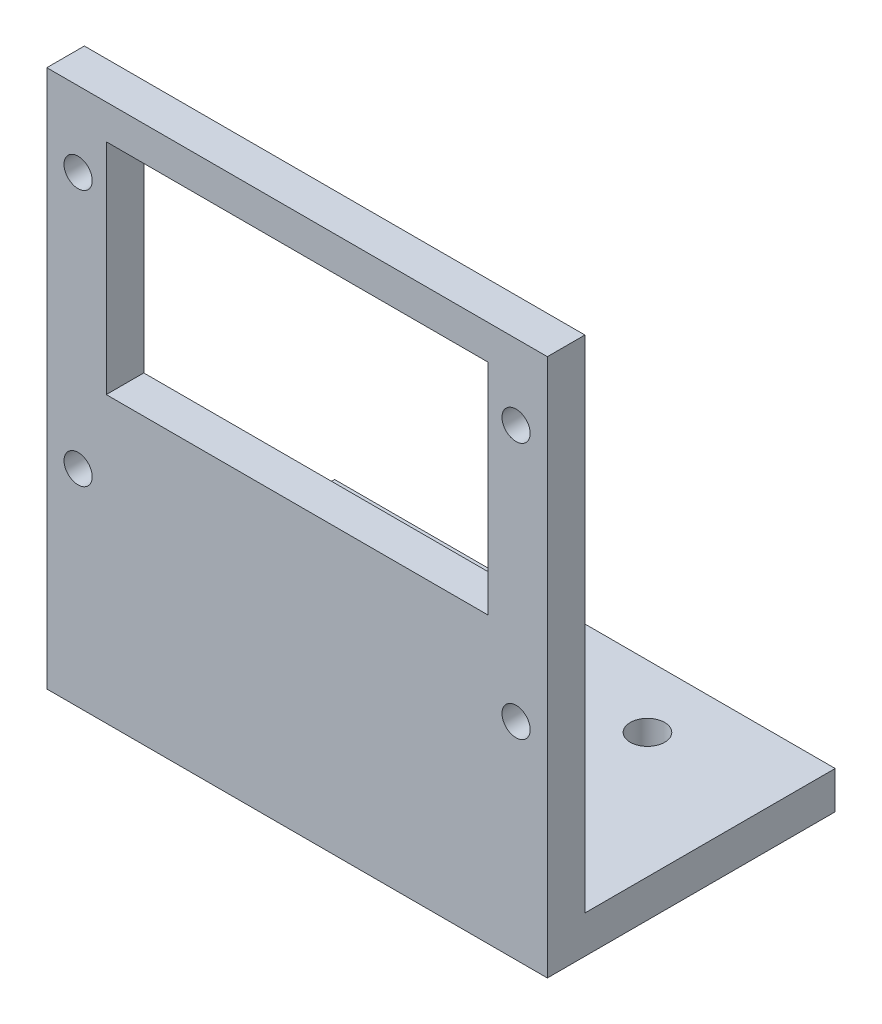
ISO-10303-21;
HEADER;
FILE_DESCRIPTION(('STEP AP214'),'2;1');
FILE_NAME('part.step','',(''),(''),'','','');
FILE_SCHEMA(('AUTOMOTIVE_DESIGN { 1 0 10303 214 1 1 1 1 }'));
ENDSEC;
DATA;
#1=APPLICATION_CONTEXT('core data for automotive mechanical design processes');
#2=APPLICATION_PROTOCOL_DEFINITION('international standard','automotive_design',2000,#1);
#3=PRODUCT_CONTEXT('',#1,'mechanical');
#4=PRODUCT('Part','Part','',(#3));
#5=PRODUCT_RELATED_PRODUCT_CATEGORY('part','',(#4));
#6=PRODUCT_DEFINITION_FORMATION('','',#4);
#7=PRODUCT_DEFINITION_CONTEXT('part definition',#1,'design');
#8=PRODUCT_DEFINITION('design','',#6,#7);
#9=PRODUCT_DEFINITION_SHAPE('','',#8);
#10=(LENGTH_UNIT() NAMED_UNIT(*) SI_UNIT(.MILLI.,.METRE.));
#11=(NAMED_UNIT(*) PLANE_ANGLE_UNIT() SI_UNIT($,.RADIAN.));
#12=(NAMED_UNIT(*) SI_UNIT($,.STERADIAN.) SOLID_ANGLE_UNIT());
#13=UNCERTAINTY_MEASURE_WITH_UNIT(LENGTH_MEASURE(1.E-05),#10,'distance_accuracy_value','');
#14=(GEOMETRIC_REPRESENTATION_CONTEXT(3) GLOBAL_UNCERTAINTY_ASSIGNED_CONTEXT((#13)) GLOBAL_UNIT_ASSIGNED_CONTEXT((#10,
#11,#12)) REPRESENTATION_CONTEXT('',''));
#15=CARTESIAN_POINT('',(0.,0.,0.));
#16=DIRECTION('',(0.,0.,1.));
#17=DIRECTION('',(1.,0.,0.));
#18=AXIS2_PLACEMENT_3D('',#15,#16,#17);
#19=CARTESIAN_POINT('',(20.,0.001899999999978,10.));
#20=DIRECTION('',(0.,1.,0.));
#21=DIRECTION('',(0.,0.,1.));
#22=AXIS2_PLACEMENT_3D('',#19,#20,#21);
#23=CYLINDRICAL_SURFACE('',#22,2.75);
#24=CARTESIAN_POINT('',(20.,0.001899999999978,10.));
#25=DIRECTION('',(0.,1.,0.));
#26=DIRECTION('',(0.,0.,1.));
#27=AXIS2_PLACEMENT_3D('',#24,#25,#26);
#28=CIRCLE('',#27,2.75);
#29=CARTESIAN_POINT('',(20.,0.001899999999978,12.75));
#30=VERTEX_POINT('',#29);
#31=EDGE_CURVE('E119',#30,#30,#28,.F.);
#32=ORIENTED_EDGE('',*,*,#31,.T.);
#33=EDGE_LOOP('',(#32));
#34=FACE_BOUND('',#33,.T.);
#35=CARTESIAN_POINT('',(20.,6.0019,10.));
#36=DIRECTION('',(0.,1.,0.));
#37=DIRECTION('',(0.,0.,1.));
#38=AXIS2_PLACEMENT_3D('',#35,#36,#37);
#39=CIRCLE('',#38,2.75);
#40=CARTESIAN_POINT('',(20.,6.0019,12.75));
#41=VERTEX_POINT('',#40);
#42=EDGE_CURVE('E18',#41,#41,#39,.F.);
#43=ORIENTED_EDGE('',*,*,#42,.F.);
#44=EDGE_LOOP('',(#43));
#45=FACE_BOUND('',#44,.T.);
#46=ADVANCED_FACE('F15',(#34,#45),#23,.F.);
#47=CARTESIAN_POINT('',(20.,0.001899999999978,30.));
#48=DIRECTION('',(0.,1.,0.));
#49=DIRECTION('',(0.,0.,1.));
#50=AXIS2_PLACEMENT_3D('',#47,#48,#49);
#51=CYLINDRICAL_SURFACE('',#50,2.75);
#52=CARTESIAN_POINT('',(20.,0.001899999999978,30.));
#53=DIRECTION('',(0.,1.,0.));
#54=DIRECTION('',(0.,0.,1.));
#55=AXIS2_PLACEMENT_3D('',#52,#53,#54);
#56=CIRCLE('',#55,2.75);
#57=CARTESIAN_POINT('',(20.,0.001899999999978,32.75));
#58=VERTEX_POINT('',#57);
#59=EDGE_CURVE('E154',#58,#58,#56,.F.);
#60=ORIENTED_EDGE('',*,*,#59,.T.);
#61=EDGE_LOOP('',(#60));
#62=FACE_BOUND('',#61,.T.);
#63=CARTESIAN_POINT('',(20.,6.0019,30.));
#64=DIRECTION('',(0.,1.,0.));
#65=DIRECTION('',(0.,0.,1.));
#66=AXIS2_PLACEMENT_3D('',#63,#64,#65);
#67=CIRCLE('',#66,2.75);
#68=CARTESIAN_POINT('',(20.,6.0019,32.75));
#69=VERTEX_POINT('',#68);
#70=EDGE_CURVE('E163',#69,#69,#67,.F.);
#71=ORIENTED_EDGE('',*,*,#70,.F.);
#72=EDGE_LOOP('',(#71));
#73=FACE_BOUND('',#72,.T.);
#74=ADVANCED_FACE('F172',(#62,#73),#51,.F.);
#75=CARTESIAN_POINT('',(60.,0.001899999999978,10.));
#76=DIRECTION('',(0.,1.,0.));
#77=DIRECTION('',(0.,0.,1.));
#78=AXIS2_PLACEMENT_3D('',#75,#76,#77);
#79=CYLINDRICAL_SURFACE('',#78,2.75);
#80=CARTESIAN_POINT('',(60.,0.001899999999978,10.));
#81=DIRECTION('',(0.,1.,0.));
#82=DIRECTION('',(0.,0.,1.));
#83=AXIS2_PLACEMENT_3D('',#80,#81,#82);
#84=CIRCLE('',#83,2.75);
#85=CARTESIAN_POINT('',(60.,0.001899999999978,12.75));
#86=VERTEX_POINT('',#85);
#87=EDGE_CURVE('E151',#86,#86,#84,.F.);
#88=ORIENTED_EDGE('',*,*,#87,.T.);
#89=EDGE_LOOP('',(#88));
#90=FACE_BOUND('',#89,.T.);
#91=CARTESIAN_POINT('',(60.,6.0019,10.));
#92=DIRECTION('',(0.,1.,0.));
#93=DIRECTION('',(0.,0.,1.));
#94=AXIS2_PLACEMENT_3D('',#91,#92,#93);
#95=CIRCLE('',#94,2.75);
#96=CARTESIAN_POINT('',(60.,6.0019,12.75));
#97=VERTEX_POINT('',#96);
#98=EDGE_CURVE('E161',#97,#97,#95,.F.);
#99=ORIENTED_EDGE('',*,*,#98,.F.);
#100=EDGE_LOOP('',(#99));
#101=FACE_BOUND('',#100,.T.);
#102=ADVANCED_FACE('F178',(#90,#101),#79,.F.);
#103=CARTESIAN_POINT('',(60.,0.001899999999978,30.));
#104=DIRECTION('',(0.,1.,0.));
#105=DIRECTION('',(0.,0.,1.));
#106=AXIS2_PLACEMENT_3D('',#103,#104,#105);
#107=CYLINDRICAL_SURFACE('',#106,2.75);
#108=CARTESIAN_POINT('',(60.,0.001899999999978,30.));
#109=DIRECTION('',(0.,1.,0.));
#110=DIRECTION('',(0.,0.,1.));
#111=AXIS2_PLACEMENT_3D('',#108,#109,#110);
#112=CIRCLE('',#111,2.75);
#113=CARTESIAN_POINT('',(60.,0.001899999999978,32.75));
#114=VERTEX_POINT('',#113);
#115=EDGE_CURVE('E147',#114,#114,#112,.F.);
#116=ORIENTED_EDGE('',*,*,#115,.T.);
#117=EDGE_LOOP('',(#116));
#118=FACE_BOUND('',#117,.T.);
#119=CARTESIAN_POINT('',(60.,6.0019,30.));
#120=DIRECTION('',(0.,1.,0.));
#121=DIRECTION('',(0.,0.,1.));
#122=AXIS2_PLACEMENT_3D('',#119,#120,#121);
#123=CIRCLE('',#122,2.75);
#124=CARTESIAN_POINT('',(60.,6.0019,32.75));
#125=VERTEX_POINT('',#124);
#126=EDGE_CURVE('E105',#125,#125,#123,.F.);
#127=ORIENTED_EDGE('',*,*,#126,.F.);
#128=EDGE_LOOP('',(#127));
#129=FACE_BOUND('',#128,.T.);
#130=ADVANCED_FACE('F257',(#118,#129),#107,.F.);
#131=CARTESIAN_POINT('',(0.,0.001899999999978,0.));
#132=DIRECTION('',(0.,0.,1.));
#133=DIRECTION('',(1.,0.,0.));
#134=AXIS2_PLACEMENT_3D('',#131,#132,#133);
#135=PLANE('',#134);
#136=DIRECTION('',(0.,1.,0.));
#137=VECTOR('',#136,1.);
#138=CARTESIAN_POINT('',(80.,0.001899999999978,0.));
#139=LINE('',#138,#137);
#140=CARTESIAN_POINT('',(80.,0.001899999999978,0.));
#141=VERTEX_POINT('',#140);
#142=CARTESIAN_POINT('',(80.,6.0019,0.));
#143=VERTEX_POINT('',#142);
#144=EDGE_CURVE('E150',#141,#143,#139,.T.);
#145=ORIENTED_EDGE('',*,*,#144,.F.);
#146=DIRECTION('',(1.,0.,0.));
#147=VECTOR('',#146,1.);
#148=CARTESIAN_POINT('',(0.,0.001899999999978,0.));
#149=LINE('',#148,#147);
#150=CARTESIAN_POINT('',(0.,0.001899999999978,0.));
#151=VERTEX_POINT('',#150);
#152=EDGE_CURVE('E101',#141,#151,#149,.F.);
#153=ORIENTED_EDGE('',*,*,#152,.T.);
#154=DIRECTION('',(0.,1.,0.));
#155=VECTOR('',#154,1.);
#156=CARTESIAN_POINT('',(0.,0.001899999999978,0.));
#157=LINE('',#156,#155);
#158=CARTESIAN_POINT('',(0.,6.0019,0.));
#159=VERTEX_POINT('',#158);
#160=EDGE_CURVE('E95',#151,#159,#157,.T.);
#161=ORIENTED_EDGE('',*,*,#160,.T.);
#162=DIRECTION('',(1.,0.,0.));
#163=VECTOR('',#162,1.);
#164=CARTESIAN_POINT('',(0.,6.0019,0.));
#165=LINE('',#164,#163);
#166=EDGE_CURVE('E99',#143,#159,#165,.F.);
#167=ORIENTED_EDGE('',*,*,#166,.F.);
#168=EDGE_LOOP('',(#145,#153,#161,#167));
#169=FACE_BOUND('',#168,.T.);
#170=ADVANCED_FACE('F98',(#169),#135,.F.);
#171=CARTESIAN_POINT('',(0.,6.0019,0.));
#172=DIRECTION('',(0.,1.,0.));
#173=DIRECTION('',(0.,0.,1.));
#174=AXIS2_PLACEMENT_3D('',#171,#172,#173);
#175=PLANE('',#174);
#176=ORIENTED_EDGE('',*,*,#126,.T.);
#177=EDGE_LOOP('',(#176));
#178=FACE_BOUND('',#177,.T.);
#179=ORIENTED_EDGE('',*,*,#98,.T.);
#180=EDGE_LOOP('',(#179));
#181=FACE_BOUND('',#180,.T.);
#182=ORIENTED_EDGE('',*,*,#70,.T.);
#183=EDGE_LOOP('',(#182));
#184=FACE_BOUND('',#183,.T.);
#185=ORIENTED_EDGE('',*,*,#42,.T.);
#186=EDGE_LOOP('',(#185));
#187=FACE_BOUND('',#186,.T.);
#188=DIRECTION('',(1.,0.,0.));
#189=VECTOR('',#188,1.);
#190=CARTESIAN_POINT('',(0.,6.0019,40.));
#191=LINE('',#190,#189);
#192=CARTESIAN_POINT('',(0.,6.0019,40.));
#193=VERTEX_POINT('',#192);
#194=CARTESIAN_POINT('',(80.,6.0019,40.));
#195=VERTEX_POINT('',#194);
#196=EDGE_CURVE('E146',#193,#195,#191,.T.);
#197=ORIENTED_EDGE('',*,*,#196,.T.);
#198=DIRECTION('',(0.,0.,-1.));
#199=VECTOR('',#198,1.);
#200=CARTESIAN_POINT('',(80.,6.0019,0.));
#201=LINE('',#200,#199);
#202=EDGE_CURVE('E111',#143,#195,#201,.F.);
#203=ORIENTED_EDGE('',*,*,#202,.F.);
#204=ORIENTED_EDGE('',*,*,#166,.T.);
#205=DIRECTION('',(0.,0.,-1.));
#206=VECTOR('',#205,1.);
#207=CARTESIAN_POINT('',(0.,6.0019,0.));
#208=LINE('',#207,#206);
#209=EDGE_CURVE('E104',#159,#193,#208,.F.);
#210=ORIENTED_EDGE('',*,*,#209,.T.);
#211=EDGE_LOOP('',(#197,#203,#204,#210));
#212=FACE_BOUND('',#211,.T.);
#213=ADVANCED_FACE('F108',(#178,#181,#184,#187,#212),#175,.T.);
#214=CARTESIAN_POINT('',(5.,33.0019,40.0000000003047));
#215=DIRECTION('',(0.,0.,-1.));
#216=DIRECTION('',(-1.,0.,0.));
#217=AXIS2_PLACEMENT_3D('',#214,#215,#216);
#218=CONICAL_SURFACE('',#217,3.99999999984402,0.718829999623637);
#219=CARTESIAN_POINT('',(5.,33.0019,40.0000000000773));
#220=DIRECTION('',(0.,0.,-1.));
#221=DIRECTION('',(-1.,0.,0.));
#222=AXIS2_PLACEMENT_3D('',#219,#220,#221);
#223=CIRCLE('',#222,4.00000000004297);
#224=CARTESIAN_POINT('',(0.999999999957027,33.0019,40.0000000000773));
#225=VERTEX_POINT('',#224);
#226=EDGE_CURVE('E143',#225,#225,#223,.T.);
#227=ORIENTED_EDGE('',*,*,#226,.T.);
#228=EDGE_LOOP('',(#227));
#229=FACE_BOUND('',#228,.T.);
#230=CARTESIAN_POINT('',(5.,33.0019,42.));
#231=DIRECTION('',(0.,0.,1.));
#232=DIRECTION('',(1.,0.,0.));
#233=AXIS2_PLACEMENT_3D('',#230,#231,#232);
#234=CIRCLE('',#233,2.25);
#235=CARTESIAN_POINT('',(7.25,33.0019,42.));
#236=VERTEX_POINT('',#235);
#237=EDGE_CURVE('E428',#236,#236,#234,.T.);
#238=ORIENTED_EDGE('',*,*,#237,.T.);
#239=EDGE_LOOP('',(#238));
#240=FACE_BOUND('',#239,.T.);
#241=ADVANCED_FACE('F247',(#229,#240),#218,.F.);
#242=CARTESIAN_POINT('',(75.,33.0019,40.0000000003615));
#243=DIRECTION('',(0.,0.,-1.));
#244=DIRECTION('',(-1.,0.,0.));
#245=AXIS2_PLACEMENT_3D('',#242,#243,#244);
#246=CONICAL_SURFACE('',#245,3.99999999978036,0.718829999621625);
#247=CARTESIAN_POINT('',(75.,33.0019,40.0000000000773));
#248=DIRECTION('',(0.,0.,-1.));
#249=DIRECTION('',(-1.,0.,0.));
#250=AXIS2_PLACEMENT_3D('',#247,#248,#249);
#251=CIRCLE('',#250,4.00000000002905);
#252=CARTESIAN_POINT('',(70.999999999971,33.0019,40.0000000000773));
#253=VERTEX_POINT('',#252);
#254=EDGE_CURVE('E140',#253,#253,#251,.T.);
#255=ORIENTED_EDGE('',*,*,#254,.T.);
#256=EDGE_LOOP('',(#255));
#257=FACE_BOUND('',#256,.T.);
#258=CARTESIAN_POINT('',(75.,33.0019,42.));
#259=DIRECTION('',(0.,0.,1.));
#260=DIRECTION('',(1.,0.,0.));
#261=AXIS2_PLACEMENT_3D('',#258,#259,#260);
#262=CIRCLE('',#261,2.25);
#263=CARTESIAN_POINT('',(77.25,33.0019,42.));
#264=VERTEX_POINT('',#263);
#265=EDGE_CURVE('E430',#264,#264,#262,.T.);
#266=ORIENTED_EDGE('',*,*,#265,.T.);
#267=EDGE_LOOP('',(#266));
#268=FACE_BOUND('',#267,.T.);
#269=ADVANCED_FACE('F243',(#257,#268),#246,.F.);
#270=CARTESIAN_POINT('',(5.,74.0019,40.0000000003047));
#271=DIRECTION('',(0.,0.,-1.));
#272=DIRECTION('',(-1.,0.,0.));
#273=AXIS2_PLACEMENT_3D('',#270,#271,#272);
#274=CONICAL_SURFACE('',#273,3.99999999984402,0.718829999623637);
#275=CARTESIAN_POINT('',(5.,74.0019,40.0000000000773));
#276=DIRECTION('',(0.,0.,-1.));
#277=DIRECTION('',(-1.,0.,0.));
#278=AXIS2_PLACEMENT_3D('',#275,#276,#277);
#279=CIRCLE('',#278,4.00000000004297);
#280=CARTESIAN_POINT('',(0.999999999957027,74.0019,40.0000000000773));
#281=VERTEX_POINT('',#280);
#282=EDGE_CURVE('E137',#281,#281,#279,.T.);
#283=ORIENTED_EDGE('',*,*,#282,.T.);
#284=EDGE_LOOP('',(#283));
#285=FACE_BOUND('',#284,.T.);
#286=CARTESIAN_POINT('',(5.,74.0019,42.));
#287=DIRECTION('',(0.,0.,1.));
#288=DIRECTION('',(1.,0.,0.));
#289=AXIS2_PLACEMENT_3D('',#286,#287,#288);
#290=CIRCLE('',#289,2.25);
#291=CARTESIAN_POINT('',(7.25,74.0019,42.));
#292=VERTEX_POINT('',#291);
#293=EDGE_CURVE('E434',#292,#292,#290,.T.);
#294=ORIENTED_EDGE('',*,*,#293,.T.);
#295=EDGE_LOOP('',(#294));
#296=FACE_BOUND('',#295,.T.);
#297=ADVANCED_FACE('F239',(#285,#296),#274,.F.);
#298=CARTESIAN_POINT('',(0.,0.001899999999978,40.));
#299=DIRECTION('',(0.,0.,1.));
#300=DIRECTION('',(1.,0.,0.));
#301=AXIS2_PLACEMENT_3D('',#298,#299,#300);
#302=PLANE('',#301);
#303=CARTESIAN_POINT('',(75.,74.0019,40.0000000000773));
#304=DIRECTION('',(0.,0.,-1.));
#305=DIRECTION('',(-1.,0.,0.));
#306=AXIS2_PLACEMENT_3D('',#303,#304,#305);
#307=CIRCLE('',#306,4.00000000002905);
#308=CARTESIAN_POINT('',(70.999999999971,74.0019,40.0000000000773));
#309=VERTEX_POINT('',#308);
#310=EDGE_CURVE('E134',#309,#309,#307,.F.);
#311=ORIENTED_EDGE('',*,*,#310,.T.);
#312=EDGE_LOOP('',(#311));
#313=FACE_BOUND('',#312,.T.);
#314=DIRECTION('',(0.,1.,0.));
#315=VECTOR('',#314,1.);
#316=CARTESIAN_POINT('',(70.5,45.5019,40.));
#317=LINE('',#316,#315);
#318=CARTESIAN_POINT('',(70.5,45.5019,40.));
#319=VERTEX_POINT('',#318);
#320=CARTESIAN_POINT('',(70.5,80.5019,40.));
#321=VERTEX_POINT('',#320);
#322=EDGE_CURVE('E481',#319,#321,#317,.T.);
#323=ORIENTED_EDGE('',*,*,#322,.T.);
#324=DIRECTION('',(1.,0.,0.));
#325=VECTOR('',#324,1.);
#326=CARTESIAN_POINT('',(9.5,80.5019,40.));
#327=LINE('',#326,#325);
#328=CARTESIAN_POINT('',(9.5,80.5019,40.));
#329=VERTEX_POINT('',#328);
#330=EDGE_CURVE('E485',#321,#329,#327,.F.);
#331=ORIENTED_EDGE('',*,*,#330,.T.);
#332=DIRECTION('',(0.,1.,0.));
#333=VECTOR('',#332,1.);
#334=CARTESIAN_POINT('',(9.5,45.5019,40.));
#335=LINE('',#334,#333);
#336=CARTESIAN_POINT('',(9.5,45.5019,40.));
#337=VERTEX_POINT('',#336);
#338=EDGE_CURVE('E487',#337,#329,#335,.T.);
#339=ORIENTED_EDGE('',*,*,#338,.F.);
#340=DIRECTION('',(1.,0.,0.));
#341=VECTOR('',#340,1.);
#342=CARTESIAN_POINT('',(9.5,45.5019,40.));
#343=LINE('',#342,#341);
#344=EDGE_CURVE('E476',#319,#337,#343,.F.);
#345=ORIENTED_EDGE('',*,*,#344,.F.);
#346=EDGE_LOOP('',(#323,#331,#339,#345));
#347=FACE_BOUND('',#346,.T.);
#348=ORIENTED_EDGE('',*,*,#282,.F.);
#349=EDGE_LOOP('',(#348));
#350=FACE_BOUND('',#349,.T.);
#351=ORIENTED_EDGE('',*,*,#254,.F.);
#352=EDGE_LOOP('',(#351));
#353=FACE_BOUND('',#352,.T.);
#354=ORIENTED_EDGE('',*,*,#226,.F.);
#355=EDGE_LOOP('',(#354));
#356=FACE_BOUND('',#355,.T.);
#357=DIRECTION('',(0.,1.,0.));
#358=VECTOR('',#357,1.);
#359=CARTESIAN_POINT('',(80.,0.001899999999978,40.));
#360=LINE('',#359,#358);
#361=CARTESIAN_POINT('',(80.,86.0019,40.));
#362=VERTEX_POINT('',#361);
#363=EDGE_CURVE('E446',#195,#362,#360,.T.);
#364=ORIENTED_EDGE('',*,*,#363,.F.);
#365=ORIENTED_EDGE('',*,*,#196,.F.);
#366=DIRECTION('',(0.,1.,0.));
#367=VECTOR('',#366,1.);
#368=CARTESIAN_POINT('',(0.,0.001899999999978,40.));
#369=LINE('',#368,#367);
#370=CARTESIAN_POINT('',(0.,86.0019,40.));
#371=VERTEX_POINT('',#370);
#372=EDGE_CURVE('E117',#193,#371,#369,.T.);
#373=ORIENTED_EDGE('',*,*,#372,.T.);
#374=DIRECTION('',(1.,0.,0.));
#375=VECTOR('',#374,1.);
#376=CARTESIAN_POINT('',(0.,86.0019,40.));
#377=LINE('',#376,#375);
#378=EDGE_CURVE('E443',#362,#371,#377,.F.);
#379=ORIENTED_EDGE('',*,*,#378,.F.);
#380=EDGE_LOOP('',(#364,#365,#373,#379));
#381=FACE_BOUND('',#380,.T.);
#382=ADVANCED_FACE('F235',(#313,#347,#350,#353,#356,#381),#302,.F.);
#383=CARTESIAN_POINT('',(75.,74.0019,40.0000000003615));
#384=DIRECTION('',(0.,0.,-1.));
#385=DIRECTION('',(-1.,0.,0.));
#386=AXIS2_PLACEMENT_3D('',#383,#384,#385);
#387=CONICAL_SURFACE('',#386,3.99999999978036,0.718829999621625);
#388=ORIENTED_EDGE('',*,*,#310,.F.);
#389=EDGE_LOOP('',(#388));
#390=FACE_BOUND('',#389,.T.);
#391=CARTESIAN_POINT('',(75.,74.0019,42.));
#392=DIRECTION('',(0.,0.,1.));
#393=DIRECTION('',(1.,0.,0.));
#394=AXIS2_PLACEMENT_3D('',#391,#392,#393);
#395=CIRCLE('',#394,2.25);
#396=CARTESIAN_POINT('',(77.25,74.0019,42.));
#397=VERTEX_POINT('',#396);
#398=EDGE_CURVE('E466',#397,#397,#395,.T.);
#399=ORIENTED_EDGE('',*,*,#398,.T.);
#400=EDGE_LOOP('',(#399));
#401=FACE_BOUND('',#400,.T.);
#402=ADVANCED_FACE('F232',(#390,#401),#387,.F.);
#403=CARTESIAN_POINT('',(0.,0.001899999999978,40.));
#404=DIRECTION('',(1.,0.,0.));
#405=DIRECTION('',(0.,0.,-1.));
#406=AXIS2_PLACEMENT_3D('',#403,#404,#405);
#407=PLANE('',#406);
#408=DIRECTION('',(0.,0.,1.));
#409=VECTOR('',#408,1.);
#410=CARTESIAN_POINT('',(0.,86.0019,40.));
#411=LINE('',#410,#409);
#412=CARTESIAN_POINT('',(0.,86.0019,46.));
#413=VERTEX_POINT('',#412);
#414=EDGE_CURVE('E437',#371,#413,#411,.T.);
#415=ORIENTED_EDGE('',*,*,#414,.F.);
#416=ORIENTED_EDGE('',*,*,#372,.F.);
#417=ORIENTED_EDGE('',*,*,#209,.F.);
#418=ORIENTED_EDGE('',*,*,#160,.F.);
#419=DIRECTION('',(0.,0.,1.));
#420=VECTOR('',#419,1.);
#421=CARTESIAN_POINT('',(0.,0.001899999999978,40.));
#422=LINE('',#421,#420);
#423=CARTESIAN_POINT('',(0.,0.001899999999978,46.));
#424=VERTEX_POINT('',#423);
#425=EDGE_CURVE('E90',#151,#424,#422,.T.);
#426=ORIENTED_EDGE('',*,*,#425,.T.);
#427=DIRECTION('',(0.,1.,0.));
#428=VECTOR('',#427,1.);
#429=CARTESIAN_POINT('',(0.,0.001899999999978,46.));
#430=LINE('',#429,#428);
#431=EDGE_CURVE('E462',#413,#424,#430,.F.);
#432=ORIENTED_EDGE('',*,*,#431,.F.);
#433=EDGE_LOOP('',(#415,#416,#417,#418,#426,#432));
#434=FACE_BOUND('',#433,.T.);
#435=ADVANCED_FACE('F116',(#434),#407,.F.);
#436=CARTESIAN_POINT('',(0.,0.001899999999978,40.));
#437=DIRECTION('',(0.,1.,0.));
#438=DIRECTION('',(0.,0.,1.));
#439=AXIS2_PLACEMENT_3D('',#436,#437,#438);
#440=PLANE('',#439);
#441=DIRECTION('',(1.,0.,0.));
#442=VECTOR('',#441,1.);
#443=CARTESIAN_POINT('',(0.,0.001899999999978,46.));
#444=LINE('',#443,#442);
#445=CARTESIAN_POINT('',(80.,0.001899999999978,46.));
#446=VERTEX_POINT('',#445);
#447=EDGE_CURVE('E459',#424,#446,#444,.T.);
#448=ORIENTED_EDGE('',*,*,#447,.F.);
#449=ORIENTED_EDGE('',*,*,#425,.F.);
#450=ORIENTED_EDGE('',*,*,#152,.F.);
#451=DIRECTION('',(0.,0.,-1.));
#452=VECTOR('',#451,1.);
#453=CARTESIAN_POINT('',(80.,0.001899999999978,40.));
#454=LINE('',#453,#452);
#455=EDGE_CURVE('E449',#446,#141,#454,.T.);
#456=ORIENTED_EDGE('',*,*,#455,.F.);
#457=EDGE_LOOP('',(#448,#449,#450,#456));
#458=FACE_BOUND('',#457,.T.);
#459=ORIENTED_EDGE('',*,*,#115,.F.);
#460=EDGE_LOOP('',(#459));
#461=FACE_BOUND('',#460,.T.);
#462=ORIENTED_EDGE('',*,*,#87,.F.);
#463=EDGE_LOOP('',(#462));
#464=FACE_BOUND('',#463,.T.);
#465=ORIENTED_EDGE('',*,*,#59,.F.);
#466=EDGE_LOOP('',(#465));
#467=FACE_BOUND('',#466,.T.);
#468=ORIENTED_EDGE('',*,*,#31,.F.);
#469=EDGE_LOOP('',(#468));
#470=FACE_BOUND('',#469,.T.);
#471=ADVANCED_FACE('F226',(#458,#461,#464,#467,#470),#440,.F.);
#472=CARTESIAN_POINT('',(80.,0.001899999999978,40.));
#473=DIRECTION('',(1.,0.,0.));
#474=DIRECTION('',(0.,0.,-1.));
#475=AXIS2_PLACEMENT_3D('',#472,#473,#474);
#476=PLANE('',#475);
#477=DIRECTION('',(0.,0.,1.));
#478=VECTOR('',#477,1.);
#479=CARTESIAN_POINT('',(80.,86.0019,40.));
#480=LINE('',#479,#478);
#481=CARTESIAN_POINT('',(80.,86.0019,46.));
#482=VERTEX_POINT('',#481);
#483=EDGE_CURVE('E431',#482,#362,#480,.F.);
#484=ORIENTED_EDGE('',*,*,#483,.F.);
#485=DIRECTION('',(0.,1.,0.));
#486=VECTOR('',#485,1.);
#487=CARTESIAN_POINT('',(80.,0.001899999999978,46.));
#488=LINE('',#487,#486);
#489=EDGE_CURVE('E457',#446,#482,#488,.T.);
#490=ORIENTED_EDGE('',*,*,#489,.F.);
#491=ORIENTED_EDGE('',*,*,#455,.T.);
#492=ORIENTED_EDGE('',*,*,#144,.T.);
#493=ORIENTED_EDGE('',*,*,#202,.T.);
#494=ORIENTED_EDGE('',*,*,#363,.T.);
#495=EDGE_LOOP('',(#484,#490,#491,#492,#493,#494));
#496=FACE_BOUND('',#495,.T.);
#497=ADVANCED_FACE('F222',(#496),#476,.T.);
#498=CARTESIAN_POINT('',(0.,86.0019,40.));
#499=DIRECTION('',(0.,1.,0.));
#500=DIRECTION('',(0.,0.,1.));
#501=AXIS2_PLACEMENT_3D('',#498,#499,#500);
#502=PLANE('',#501);
#503=DIRECTION('',(1.,0.,0.));
#504=VECTOR('',#503,1.);
#505=CARTESIAN_POINT('',(0.,86.0019,46.));
#506=LINE('',#505,#504);
#507=EDGE_CURVE('E133',#482,#413,#506,.F.);
#508=ORIENTED_EDGE('',*,*,#507,.F.);
#509=ORIENTED_EDGE('',*,*,#483,.T.);
#510=ORIENTED_EDGE('',*,*,#378,.T.);
#511=ORIENTED_EDGE('',*,*,#414,.T.);
#512=EDGE_LOOP('',(#508,#509,#510,#511));
#513=FACE_BOUND('',#512,.T.);
#514=ADVANCED_FACE('F218',(#513),#502,.T.);
#515=CARTESIAN_POINT('',(5.,33.0019,40.));
#516=DIRECTION('',(0.,0.,1.));
#517=DIRECTION('',(1.,0.,0.));
#518=AXIS2_PLACEMENT_3D('',#515,#516,#517);
#519=CYLINDRICAL_SURFACE('',#518,2.25);
#520=CARTESIAN_POINT('',(5.,33.0019,46.));
#521=DIRECTION('',(0.,0.,1.));
#522=DIRECTION('',(1.,0.,0.));
#523=AXIS2_PLACEMENT_3D('',#520,#521,#522);
#524=CIRCLE('',#523,2.25);
#525=CARTESIAN_POINT('',(7.25,33.0019,46.));
#526=VERTEX_POINT('',#525);
#527=EDGE_CURVE('E130',#526,#526,#524,.F.);
#528=ORIENTED_EDGE('',*,*,#527,.F.);
#529=EDGE_LOOP('',(#528));
#530=FACE_BOUND('',#529,.T.);
#531=ORIENTED_EDGE('',*,*,#237,.F.);
#532=EDGE_LOOP('',(#531));
#533=FACE_BOUND('',#532,.T.);
#534=ADVANCED_FACE('F214',(#530,#533),#519,.F.);
#535=CARTESIAN_POINT('',(75.,33.0019,40.));
#536=DIRECTION('',(0.,0.,1.));
#537=DIRECTION('',(1.,0.,0.));
#538=AXIS2_PLACEMENT_3D('',#535,#536,#537);
#539=CYLINDRICAL_SURFACE('',#538,2.25);
#540=CARTESIAN_POINT('',(75.,33.0019,46.));
#541=DIRECTION('',(0.,0.,1.));
#542=DIRECTION('',(1.,0.,0.));
#543=AXIS2_PLACEMENT_3D('',#540,#541,#542);
#544=CIRCLE('',#543,2.25);
#545=CARTESIAN_POINT('',(77.25,33.0019,46.));
#546=VERTEX_POINT('',#545);
#547=EDGE_CURVE('E127',#546,#546,#544,.F.);
#548=ORIENTED_EDGE('',*,*,#547,.F.);
#549=EDGE_LOOP('',(#548));
#550=FACE_BOUND('',#549,.T.);
#551=ORIENTED_EDGE('',*,*,#265,.F.);
#552=EDGE_LOOP('',(#551));
#553=FACE_BOUND('',#552,.T.);
#554=ADVANCED_FACE('F210',(#550,#553),#539,.F.);
#555=CARTESIAN_POINT('',(5.,74.0019,40.));
#556=DIRECTION('',(0.,0.,1.));
#557=DIRECTION('',(1.,0.,0.));
#558=AXIS2_PLACEMENT_3D('',#555,#556,#557);
#559=CYLINDRICAL_SURFACE('',#558,2.25);
#560=CARTESIAN_POINT('',(5.,74.0019,46.));
#561=DIRECTION('',(0.,0.,1.));
#562=DIRECTION('',(1.,0.,0.));
#563=AXIS2_PLACEMENT_3D('',#560,#561,#562);
#564=CIRCLE('',#563,2.25);
#565=CARTESIAN_POINT('',(7.25,74.0019,46.));
#566=VERTEX_POINT('',#565);
#567=EDGE_CURVE('E123',#566,#566,#564,.F.);
#568=ORIENTED_EDGE('',*,*,#567,.F.);
#569=EDGE_LOOP('',(#568));
#570=FACE_BOUND('',#569,.T.);
#571=ORIENTED_EDGE('',*,*,#293,.F.);
#572=EDGE_LOOP('',(#571));
#573=FACE_BOUND('',#572,.T.);
#574=ADVANCED_FACE('F206',(#570,#573),#559,.F.);
#575=CARTESIAN_POINT('',(9.5,45.5019,40.));
#576=DIRECTION('',(1.,0.,0.));
#577=DIRECTION('',(0.,0.,-1.));
#578=AXIS2_PLACEMENT_3D('',#575,#576,#577);
#579=PLANE('',#578);
#580=DIRECTION('',(0.,0.,1.));
#581=VECTOR('',#580,1.);
#582=CARTESIAN_POINT('',(9.5,80.5019,40.));
#583=LINE('',#582,#581);
#584=CARTESIAN_POINT('',(9.5,80.5019,46.));
#585=VERTEX_POINT('',#584);
#586=EDGE_CURVE('E483',#329,#585,#583,.T.);
#587=ORIENTED_EDGE('',*,*,#586,.T.);
#588=DIRECTION('',(0.,1.,0.));
#589=VECTOR('',#588,1.);
#590=CARTESIAN_POINT('',(9.5,0.001899999999978,46.));
#591=LINE('',#590,#589);
#592=CARTESIAN_POINT('',(9.5,45.5019,46.));
#593=VERTEX_POINT('',#592);
#594=EDGE_CURVE('E126',#593,#585,#591,.T.);
#595=ORIENTED_EDGE('',*,*,#594,.F.);
#596=DIRECTION('',(0.,0.,1.));
#597=VECTOR('',#596,1.);
#598=CARTESIAN_POINT('',(9.5,45.5019,40.));
#599=LINE('',#598,#597);
#600=EDGE_CURVE('E473',#337,#593,#599,.T.);
#601=ORIENTED_EDGE('',*,*,#600,.F.);
#602=ORIENTED_EDGE('',*,*,#338,.T.);
#603=EDGE_LOOP('',(#587,#595,#601,#602));
#604=FACE_BOUND('',#603,.T.);
#605=ADVANCED_FACE('F202',(#604),#579,.T.);
#606=CARTESIAN_POINT('',(9.5,80.5019,40.));
#607=DIRECTION('',(0.,1.,0.));
#608=DIRECTION('',(0.,0.,1.));
#609=AXIS2_PLACEMENT_3D('',#606,#607,#608);
#610=PLANE('',#609);
#611=DIRECTION('',(1.,0.,0.));
#612=VECTOR('',#611,1.);
#613=CARTESIAN_POINT('',(0.,80.5019,46.));
#614=LINE('',#613,#612);
#615=CARTESIAN_POINT('',(70.5,80.5019,46.));
#616=VERTEX_POINT('',#615);
#617=EDGE_CURVE('E500',#585,#616,#614,.T.);
#618=ORIENTED_EDGE('',*,*,#617,.F.);
#619=ORIENTED_EDGE('',*,*,#586,.F.);
#620=ORIENTED_EDGE('',*,*,#330,.F.);
#621=DIRECTION('',(0.,0.,-1.));
#622=VECTOR('',#621,1.);
#623=CARTESIAN_POINT('',(70.5,80.5019,40.));
#624=LINE('',#623,#622);
#625=EDGE_CURVE('E479',#321,#616,#624,.F.);
#626=ORIENTED_EDGE('',*,*,#625,.T.);
#627=EDGE_LOOP('',(#618,#619,#620,#626));
#628=FACE_BOUND('',#627,.T.);
#629=ADVANCED_FACE('F199',(#628),#610,.F.);
#630=CARTESIAN_POINT('',(70.5,45.5019,40.));
#631=DIRECTION('',(1.,0.,0.));
#632=DIRECTION('',(0.,0.,-1.));
#633=AXIS2_PLACEMENT_3D('',#630,#631,#632);
#634=PLANE('',#633);
#635=ORIENTED_EDGE('',*,*,#625,.F.);
#636=ORIENTED_EDGE('',*,*,#322,.F.);
#637=DIRECTION('',(0.,0.,1.));
#638=VECTOR('',#637,1.);
#639=CARTESIAN_POINT('',(70.5,45.5019,40.));
#640=LINE('',#639,#638);
#641=CARTESIAN_POINT('',(70.5,45.5019,46.));
#642=VERTEX_POINT('',#641);
#643=EDGE_CURVE('E33',#642,#319,#640,.F.);
#644=ORIENTED_EDGE('',*,*,#643,.F.);
#645=DIRECTION('',(0.,1.,0.));
#646=VECTOR('',#645,1.);
#647=CARTESIAN_POINT('',(70.5,0.001899999999978,46.));
#648=LINE('',#647,#646);
#649=EDGE_CURVE('E503',#616,#642,#648,.F.);
#650=ORIENTED_EDGE('',*,*,#649,.F.);
#651=EDGE_LOOP('',(#635,#636,#644,#650));
#652=FACE_BOUND('',#651,.T.);
#653=ADVANCED_FACE('F195',(#652),#634,.F.);
#654=CARTESIAN_POINT('',(9.5,45.5019,40.));
#655=DIRECTION('',(0.,1.,0.));
#656=DIRECTION('',(0.,0.,1.));
#657=AXIS2_PLACEMENT_3D('',#654,#655,#656);
#658=PLANE('',#657);
#659=DIRECTION('',(1.,0.,0.));
#660=VECTOR('',#659,1.);
#661=CARTESIAN_POINT('',(0.,45.5019,46.));
#662=LINE('',#661,#660);
#663=EDGE_CURVE('E24',#642,#593,#662,.F.);
#664=ORIENTED_EDGE('',*,*,#663,.F.);
#665=ORIENTED_EDGE('',*,*,#643,.T.);
#666=ORIENTED_EDGE('',*,*,#344,.T.);
#667=ORIENTED_EDGE('',*,*,#600,.T.);
#668=EDGE_LOOP('',(#664,#665,#666,#667));
#669=FACE_BOUND('',#668,.T.);
#670=ADVANCED_FACE('F188',(#669),#658,.T.);
#671=CARTESIAN_POINT('',(75.,74.0019,40.));
#672=DIRECTION('',(0.,0.,1.));
#673=DIRECTION('',(1.,0.,0.));
#674=AXIS2_PLACEMENT_3D('',#671,#672,#673);
#675=CYLINDRICAL_SURFACE('',#674,2.25);
#676=CARTESIAN_POINT('',(75.,74.0019,46.));
#677=DIRECTION('',(0.,0.,1.));
#678=DIRECTION('',(1.,0.,0.));
#679=AXIS2_PLACEMENT_3D('',#676,#677,#678);
#680=CIRCLE('',#679,2.25);
#681=CARTESIAN_POINT('',(77.25,74.0019,46.));
#682=VERTEX_POINT('',#681);
#683=EDGE_CURVE('E9',#682,#682,#680,.F.);
#684=ORIENTED_EDGE('',*,*,#683,.F.);
#685=EDGE_LOOP('',(#684));
#686=FACE_BOUND('',#685,.T.);
#687=ORIENTED_EDGE('',*,*,#398,.F.);
#688=EDGE_LOOP('',(#687));
#689=FACE_BOUND('',#688,.T.);
#690=ADVANCED_FACE('F182',(#686,#689),#675,.F.);
#691=CARTESIAN_POINT('',(0.,0.001899999999978,46.));
#692=DIRECTION('',(0.,0.,1.));
#693=DIRECTION('',(1.,0.,0.));
#694=AXIS2_PLACEMENT_3D('',#691,#692,#693);
#695=PLANE('',#694);
#696=ORIENTED_EDGE('',*,*,#683,.T.);
#697=EDGE_LOOP('',(#696));
#698=FACE_BOUND('',#697,.T.);
#699=ORIENTED_EDGE('',*,*,#649,.T.);
#700=ORIENTED_EDGE('',*,*,#663,.T.);
#701=ORIENTED_EDGE('',*,*,#594,.T.);
#702=ORIENTED_EDGE('',*,*,#617,.T.);
#703=EDGE_LOOP('',(#699,#700,#701,#702));
#704=FACE_BOUND('',#703,.T.);
#705=ORIENTED_EDGE('',*,*,#567,.T.);
#706=EDGE_LOOP('',(#705));
#707=FACE_BOUND('',#706,.T.);
#708=ORIENTED_EDGE('',*,*,#547,.T.);
#709=EDGE_LOOP('',(#708));
#710=FACE_BOUND('',#709,.T.);
#711=ORIENTED_EDGE('',*,*,#527,.T.);
#712=EDGE_LOOP('',(#711));
#713=FACE_BOUND('',#712,.T.);
#714=ORIENTED_EDGE('',*,*,#489,.T.);
#715=ORIENTED_EDGE('',*,*,#507,.T.);
#716=ORIENTED_EDGE('',*,*,#431,.T.);
#717=ORIENTED_EDGE('',*,*,#447,.T.);
#718=EDGE_LOOP('',(#714,#715,#716,#717));
#719=FACE_BOUND('',#718,.T.);
#720=ADVANCED_FACE('F180',(#698,#704,#707,#710,#713,#719),#695,.T.);
#721=CLOSED_SHELL('',(#46,#74,#102,#130,#170,#213,#241,#269,#297,#382,#402,#435,#471,#497,#514,
#534,#554,#574,#605,#629,#653,#670,#690,#720));
#722=MANIFOLD_SOLID_BREP('B1',#721);
#723=ADVANCED_BREP_SHAPE_REPRESENTATION('',(#18,#722),#14);
#724=SHAPE_DEFINITION_REPRESENTATION(#9,#723);
ENDSEC;
END-ISO-10303-21;
